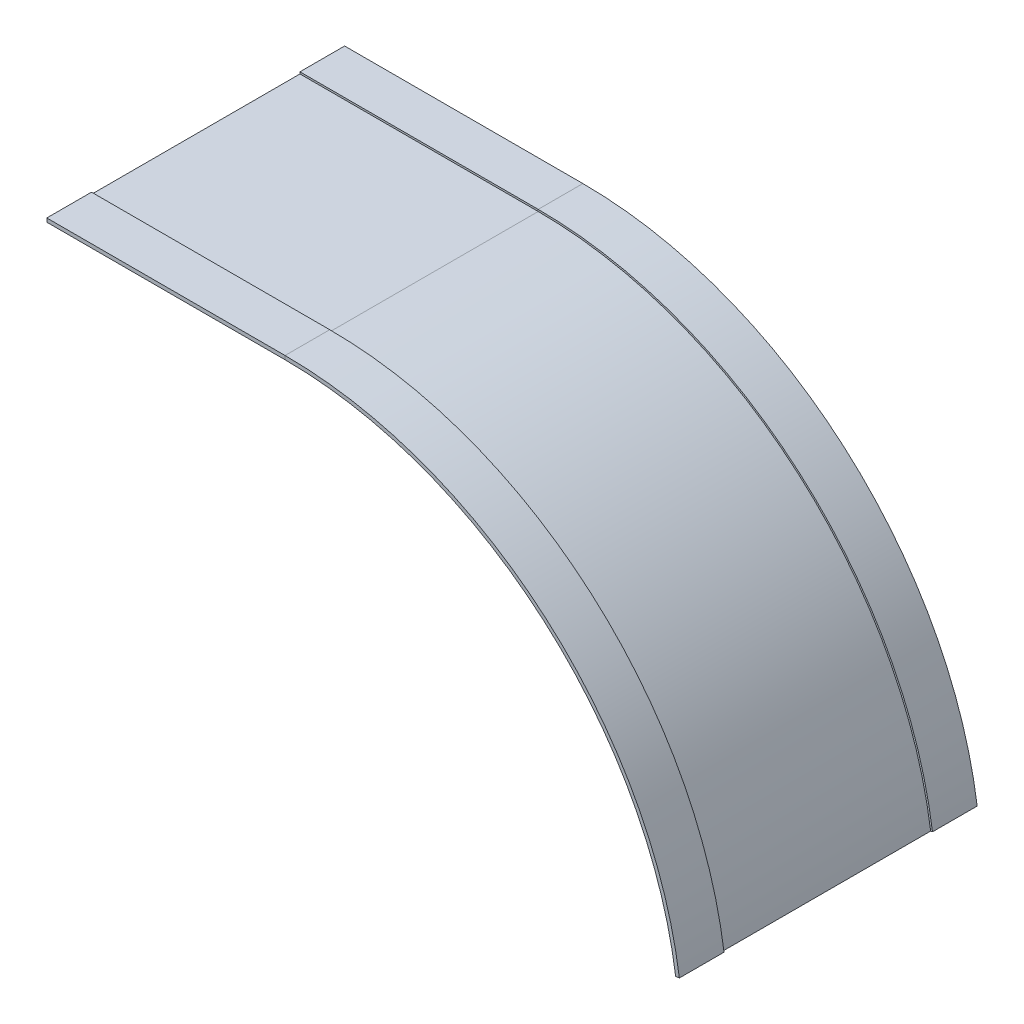
ISO-10303-21;
HEADER;
FILE_DESCRIPTION(('STEP AP214'),'2;1');
FILE_NAME('part.step','',(''),(''),'','','');
FILE_SCHEMA(('AUTOMOTIVE_DESIGN { 1 0 10303 214 1 1 1 1 }'));
ENDSEC;
DATA;
#1=APPLICATION_CONTEXT('core data for automotive mechanical design processes');
#2=APPLICATION_PROTOCOL_DEFINITION('international standard','automotive_design',2000,#1);
#3=PRODUCT_CONTEXT('',#1,'mechanical');
#4=PRODUCT('Part','Part','',(#3));
#5=PRODUCT_RELATED_PRODUCT_CATEGORY('part','',(#4));
#6=PRODUCT_DEFINITION_FORMATION('','',#4);
#7=PRODUCT_DEFINITION_CONTEXT('part definition',#1,'design');
#8=PRODUCT_DEFINITION('design','',#6,#7);
#9=PRODUCT_DEFINITION_SHAPE('','',#8);
#10=(LENGTH_UNIT() NAMED_UNIT(*) SI_UNIT(.MILLI.,.METRE.));
#11=(NAMED_UNIT(*) PLANE_ANGLE_UNIT() SI_UNIT($,.RADIAN.));
#12=(NAMED_UNIT(*) SI_UNIT($,.STERADIAN.) SOLID_ANGLE_UNIT());
#13=UNCERTAINTY_MEASURE_WITH_UNIT(LENGTH_MEASURE(1.E-05),#10,'distance_accuracy_value','');
#14=(GEOMETRIC_REPRESENTATION_CONTEXT(3) GLOBAL_UNCERTAINTY_ASSIGNED_CONTEXT((#13)) GLOBAL_UNIT_ASSIGNED_CONTEXT((#10,
#11,#12)) REPRESENTATION_CONTEXT('',''));
#15=CARTESIAN_POINT('',(0.,0.,0.));
#16=DIRECTION('',(0.,0.,1.));
#17=DIRECTION('',(1.,0.,0.));
#18=AXIS2_PLACEMENT_3D('',#15,#16,#17);
#19=CARTESIAN_POINT('',(-190.884848484848,0.,0.));
#20=DIRECTION('',(1.,0.,0.));
#21=DIRECTION('',(0.,0.,-1.));
#22=AXIS2_PLACEMENT_3D('',#19,#20,#21);
#23=PLANE('',#22);
#24=DIRECTION('',(0.,-1.,0.));
#25=VECTOR('',#24,1.);
#26=CARTESIAN_POINT('',(-190.884848484848,87.4856818181818,63.5));
#27=LINE('',#26,#25);
#28=CARTESIAN_POINT('',(-190.884848484848,87.4856818181818,63.5));
#29=VERTEX_POINT('',#28);
#30=CARTESIAN_POINT('',(-190.884848484848,85.8981818181818,63.5));
#31=VERTEX_POINT('',#30);
#32=EDGE_CURVE('E165',#29,#31,#27,.T.);
#33=ORIENTED_EDGE('',*,*,#32,.F.);
#34=DIRECTION('',(0.,0.,1.));
#35=VECTOR('',#34,1.);
#36=CARTESIAN_POINT('',(-190.884848484848,87.4856818181818,44.45));
#37=LINE('',#36,#35);
#38=CARTESIAN_POINT('',(-190.884848484848,87.4856818181818,44.45));
#39=VERTEX_POINT('',#38);
#40=EDGE_CURVE('E167',#39,#29,#37,.T.);
#41=ORIENTED_EDGE('',*,*,#40,.F.);
#42=DIRECTION('',(0.,1.,0.));
#43=VECTOR('',#42,1.);
#44=CARTESIAN_POINT('',(-190.884848484848,86.6919318181818,44.45));
#45=LINE('',#44,#43);
#46=CARTESIAN_POINT('',(-190.884848484848,86.6919318181818,44.45));
#47=VERTEX_POINT('',#46);
#48=EDGE_CURVE('E98',#47,#39,#45,.T.);
#49=ORIENTED_EDGE('',*,*,#48,.F.);
#50=DIRECTION('',(0.,0.,1.));
#51=VECTOR('',#50,1.);
#52=CARTESIAN_POINT('',(-190.884848484848,86.6919318181818,-44.45));
#53=LINE('',#52,#51);
#54=CARTESIAN_POINT('',(-190.884848484848,86.6919318181818,-44.45));
#55=VERTEX_POINT('',#54);
#56=EDGE_CURVE('E102',#55,#47,#53,.T.);
#57=ORIENTED_EDGE('',*,*,#56,.F.);
#58=DIRECTION('',(0.,-1.,0.));
#59=VECTOR('',#58,1.);
#60=CARTESIAN_POINT('',(-190.884848484848,87.4856818181818,-44.45));
#61=LINE('',#60,#59);
#62=CARTESIAN_POINT('',(-190.884848484848,87.4856818181818,-44.45));
#63=VERTEX_POINT('',#62);
#64=EDGE_CURVE('E107',#63,#55,#61,.T.);
#65=ORIENTED_EDGE('',*,*,#64,.F.);
#66=DIRECTION('',(0.,0.,1.));
#67=VECTOR('',#66,1.);
#68=CARTESIAN_POINT('',(-190.884848484848,87.4856818181818,-63.5));
#69=LINE('',#68,#67);
#70=CARTESIAN_POINT('',(-190.884848484848,87.4856818181818,-63.5));
#71=VERTEX_POINT('',#70);
#72=EDGE_CURVE('E207',#71,#63,#69,.T.);
#73=ORIENTED_EDGE('',*,*,#72,.F.);
#74=DIRECTION('',(0.,1.,0.));
#75=VECTOR('',#74,1.);
#76=CARTESIAN_POINT('',(-190.884848484848,85.8981818181818,-63.5));
#77=LINE('',#76,#75);
#78=CARTESIAN_POINT('',(-190.884848484848,85.8981818181818,-63.5));
#79=VERTEX_POINT('',#78);
#80=EDGE_CURVE('E158',#79,#71,#77,.T.);
#81=ORIENTED_EDGE('',*,*,#80,.F.);
#82=DIRECTION('',(0.,0.,-1.));
#83=VECTOR('',#82,1.);
#84=CARTESIAN_POINT('',(-190.884848484848,85.8981818181818,63.5));
#85=LINE('',#84,#83);
#86=EDGE_CURVE('E162',#31,#79,#85,.T.);
#87=ORIENTED_EDGE('',*,*,#86,.F.);
#88=EDGE_LOOP('',(#33,#41,#49,#57,#65,#73,#81,#87));
#89=FACE_BOUND('',#88,.T.);
#90=ADVANCED_FACE('F34',(#89),#23,.F.);
#91=CARTESIAN_POINT('',(-7.73699587466362,-70.7197212692968,0.));
#92=DIRECTION('',(0.141509433962264,-0.989936907130793,0.));
#93=DIRECTION('',(0.,0.,-1.));
#94=AXIS2_PLACEMENT_3D('',#91,#92,#93);
#95=PLANE('',#94);
#96=DIRECTION('',(-0.989936907130793,-0.141509433962264,0.));
#97=VECTOR('',#96,1.);
#98=CARTESIAN_POINT('',(78.8683094026559,-58.3396719554032,63.5));
#99=LINE('',#98,#97);
#100=CARTESIAN_POINT('',(78.8683094026559,-58.3396719554032,63.5));
#101=VERTEX_POINT('',#100);
#102=CARTESIAN_POINT('',(77.2967845625857,-58.5643181818183,63.5));
#103=VERTEX_POINT('',#102);
#104=EDGE_CURVE('E190',#101,#103,#99,.T.);
#105=ORIENTED_EDGE('',*,*,#104,.T.);
#106=DIRECTION('',(0.,0.,-1.));
#107=VECTOR('',#106,1.);
#108=CARTESIAN_POINT('',(77.2967845625857,-58.5643181818183,63.5));
#109=LINE('',#108,#107);
#110=CARTESIAN_POINT('',(77.2967845625857,-58.5643181818183,-63.5));
#111=VERTEX_POINT('',#110);
#112=EDGE_CURVE('E126',#103,#111,#109,.T.);
#113=ORIENTED_EDGE('',*,*,#112,.T.);
#114=DIRECTION('',(0.989936907130793,0.141509433962264,0.));
#115=VECTOR('',#114,1.);
#116=CARTESIAN_POINT('',(77.2967845625857,-58.5643181818183,-63.5));
#117=LINE('',#116,#115);
#118=CARTESIAN_POINT('',(78.8683094026559,-58.3396719554032,-63.5));
#119=VERTEX_POINT('',#118);
#120=EDGE_CURVE('E122',#111,#119,#117,.T.);
#121=ORIENTED_EDGE('',*,*,#120,.T.);
#122=DIRECTION('',(0.,0.,1.));
#123=VECTOR('',#122,1.);
#124=CARTESIAN_POINT('',(78.8683094026559,-58.3396719554032,-63.5));
#125=LINE('',#124,#123);
#126=CARTESIAN_POINT('',(78.8683094026559,-58.3396719554032,-44.45));
#127=VERTEX_POINT('',#126);
#128=EDGE_CURVE('E117',#119,#127,#125,.T.);
#129=ORIENTED_EDGE('',*,*,#128,.T.);
#130=DIRECTION('',(-0.989936907130793,-0.141509433962264,0.));
#131=VECTOR('',#130,1.);
#132=CARTESIAN_POINT('',(78.8683094026559,-58.3396719554032,-44.45));
#133=LINE('',#132,#131);
#134=CARTESIAN_POINT('',(78.0825469826208,-58.4519950686107,-44.45));
#135=VERTEX_POINT('',#134);
#136=EDGE_CURVE('E225',#127,#135,#133,.T.);
#137=ORIENTED_EDGE('',*,*,#136,.T.);
#138=DIRECTION('',(0.,0.,1.));
#139=VECTOR('',#138,1.);
#140=CARTESIAN_POINT('',(78.0825469826208,-58.4519950686107,-44.45));
#141=LINE('',#140,#139);
#142=CARTESIAN_POINT('',(78.0825469826208,-58.4519950686107,44.45));
#143=VERTEX_POINT('',#142);
#144=EDGE_CURVE('E53',#135,#143,#141,.T.);
#145=ORIENTED_EDGE('',*,*,#144,.T.);
#146=DIRECTION('',(0.989936907130793,0.141509433962264,0.));
#147=VECTOR('',#146,1.);
#148=CARTESIAN_POINT('',(78.0825469826208,-58.4519950686107,44.45));
#149=LINE('',#148,#147);
#150=CARTESIAN_POINT('',(78.8683094026559,-58.3396719554032,44.45));
#151=VERTEX_POINT('',#150);
#152=EDGE_CURVE('E47',#143,#151,#149,.T.);
#153=ORIENTED_EDGE('',*,*,#152,.T.);
#154=DIRECTION('',(0.,0.,1.));
#155=VECTOR('',#154,1.);
#156=CARTESIAN_POINT('',(78.8683094026559,-58.3396719554032,44.45));
#157=LINE('',#156,#155);
#158=EDGE_CURVE('E11',#151,#101,#157,.T.);
#159=ORIENTED_EDGE('',*,*,#158,.T.);
#160=EDGE_LOOP('',(#105,#113,#121,#129,#137,#145,#153,#159));
#161=FACE_BOUND('',#160,.T.);
#162=ADVANCED_FACE('F276',(#161),#95,.T.);
#163=CARTESIAN_POINT('',(-190.884848484848,87.4856818181818,63.5));
#164=DIRECTION('',(0.,0.,1.));
#165=DIRECTION('',(1.,0.,0.));
#166=AXIS2_PLACEMENT_3D('',#163,#164,#165);
#167=PLANE('',#166);
#168=DIRECTION('',(1.,0.,0.));
#169=VECTOR('',#168,1.);
#170=CARTESIAN_POINT('',(-190.884848484848,85.8981818181818,63.5));
#171=LINE('',#170,#169);
#172=CARTESIAN_POINT('',(-89.2848484848484,85.8981818181818,63.5));
#173=VERTEX_POINT('',#172);
#174=EDGE_CURVE('E186',#31,#173,#171,.T.);
#175=ORIENTED_EDGE('',*,*,#174,.T.);
#176=DIRECTION('',(0.,-1.,0.));
#177=VECTOR('',#176,1.);
#178=CARTESIAN_POINT('',(-89.2848484848484,87.4856818181818,63.5));
#179=LINE('',#178,#177);
#180=CARTESIAN_POINT('',(-89.2848484848484,87.4856818181818,63.5));
#181=VERTEX_POINT('',#180);
#182=EDGE_CURVE('E184',#181,#173,#179,.T.);
#183=ORIENTED_EDGE('',*,*,#182,.F.);
#184=DIRECTION('',(1.,0.,0.));
#185=VECTOR('',#184,1.);
#186=CARTESIAN_POINT('',(-190.884848484848,87.4856818181818,63.5));
#187=LINE('',#186,#185);
#188=EDGE_CURVE('E177',#29,#181,#187,.T.);
#189=ORIENTED_EDGE('',*,*,#188,.F.);
#190=ORIENTED_EDGE('',*,*,#32,.T.);
#191=EDGE_LOOP('',(#175,#183,#189,#190));
#192=FACE_BOUND('',#191,.T.);
#193=ADVANCED_FACE('F182',(#192),#167,.T.);
#194=CARTESIAN_POINT('',(-190.884848484848,85.8981818181818,63.5));
#195=DIRECTION('',(0.,-1.,0.));
#196=DIRECTION('',(0.,0.,-1.));
#197=AXIS2_PLACEMENT_3D('',#194,#195,#196);
#198=PLANE('',#197);
#199=DIRECTION('',(1.,0.,0.));
#200=VECTOR('',#199,1.);
#201=CARTESIAN_POINT('',(-190.884848484848,85.8981818181818,-63.5));
#202=LINE('',#201,#200);
#203=CARTESIAN_POINT('',(-89.2848484848484,85.8981818181818,-63.5));
#204=VERTEX_POINT('',#203);
#205=EDGE_CURVE('E200',#79,#204,#202,.T.);
#206=ORIENTED_EDGE('',*,*,#205,.T.);
#207=DIRECTION('',(0.,0.,-1.));
#208=VECTOR('',#207,1.);
#209=CARTESIAN_POINT('',(-89.2848484848484,85.8981818181818,63.5));
#210=LINE('',#209,#208);
#211=EDGE_CURVE('E198',#173,#204,#210,.T.);
#212=ORIENTED_EDGE('',*,*,#211,.F.);
#213=ORIENTED_EDGE('',*,*,#174,.F.);
#214=ORIENTED_EDGE('',*,*,#86,.T.);
#215=EDGE_LOOP('',(#206,#212,#213,#214));
#216=FACE_BOUND('',#215,.T.);
#217=ADVANCED_FACE('F272',(#216),#198,.T.);
#218=CARTESIAN_POINT('',(-190.884848484848,85.8981818181818,-63.5));
#219=DIRECTION('',(0.,0.,-1.));
#220=DIRECTION('',(-1.,0.,0.));
#221=AXIS2_PLACEMENT_3D('',#218,#219,#220);
#222=PLANE('',#221);
#223=DIRECTION('',(1.,0.,0.));
#224=VECTOR('',#223,1.);
#225=CARTESIAN_POINT('',(-190.884848484848,87.4856818181818,-63.5));
#226=LINE('',#225,#224);
#227=CARTESIAN_POINT('',(-89.2848484848484,87.4856818181818,-63.5));
#228=VERTEX_POINT('',#227);
#229=EDGE_CURVE('E209',#71,#228,#226,.T.);
#230=ORIENTED_EDGE('',*,*,#229,.T.);
#231=DIRECTION('',(0.,1.,0.));
#232=VECTOR('',#231,1.);
#233=CARTESIAN_POINT('',(-89.2848484848484,85.8981818181818,-63.5));
#234=LINE('',#233,#232);
#235=EDGE_CURVE('E203',#204,#228,#234,.T.);
#236=ORIENTED_EDGE('',*,*,#235,.F.);
#237=ORIENTED_EDGE('',*,*,#205,.F.);
#238=ORIENTED_EDGE('',*,*,#80,.T.);
#239=EDGE_LOOP('',(#230,#236,#237,#238));
#240=FACE_BOUND('',#239,.T.);
#241=ADVANCED_FACE('F267',(#240),#222,.T.);
#242=CARTESIAN_POINT('',(-190.884848484848,87.4856818181818,-63.5));
#243=DIRECTION('',(0.,1.,0.));
#244=DIRECTION('',(0.,0.,1.));
#245=AXIS2_PLACEMENT_3D('',#242,#243,#244);
#246=PLANE('',#245);
#247=DIRECTION('',(1.,0.,0.));
#248=VECTOR('',#247,1.);
#249=CARTESIAN_POINT('',(-190.884848484848,87.4856818181818,-44.45));
#250=LINE('',#249,#248);
#251=CARTESIAN_POINT('',(-89.2848484848484,87.4856818181818,-44.45));
#252=VERTEX_POINT('',#251);
#253=EDGE_CURVE('E217',#63,#252,#250,.T.);
#254=ORIENTED_EDGE('',*,*,#253,.T.);
#255=DIRECTION('',(0.,0.,1.));
#256=VECTOR('',#255,1.);
#257=CARTESIAN_POINT('',(-89.2848484848484,87.4856818181818,-63.5));
#258=LINE('',#257,#256);
#259=EDGE_CURVE('E212',#228,#252,#258,.T.);
#260=ORIENTED_EDGE('',*,*,#259,.F.);
#261=ORIENTED_EDGE('',*,*,#229,.F.);
#262=ORIENTED_EDGE('',*,*,#72,.T.);
#263=EDGE_LOOP('',(#254,#260,#261,#262));
#264=FACE_BOUND('',#263,.T.);
#265=ADVANCED_FACE('F265',(#264),#246,.T.);
#266=CARTESIAN_POINT('',(-190.884848484848,87.4856818181818,-44.45));
#267=DIRECTION('',(0.,0.,1.));
#268=DIRECTION('',(1.,0.,0.));
#269=AXIS2_PLACEMENT_3D('',#266,#267,#268);
#270=PLANE('',#269);
#271=DIRECTION('',(1.,0.,0.));
#272=VECTOR('',#271,1.);
#273=CARTESIAN_POINT('',(-190.884848484848,86.6919318181818,-44.45));
#274=LINE('',#273,#272);
#275=CARTESIAN_POINT('',(-89.2848484848484,86.6919318181818,-44.45));
#276=VERTEX_POINT('',#275);
#277=EDGE_CURVE('E229',#55,#276,#274,.T.);
#278=ORIENTED_EDGE('',*,*,#277,.T.);
#279=DIRECTION('',(0.,-1.,0.));
#280=VECTOR('',#279,1.);
#281=CARTESIAN_POINT('',(-89.2848484848484,87.4856818181818,-44.45));
#282=LINE('',#281,#280);
#283=EDGE_CURVE('E220',#252,#276,#282,.T.);
#284=ORIENTED_EDGE('',*,*,#283,.F.);
#285=ORIENTED_EDGE('',*,*,#253,.F.);
#286=ORIENTED_EDGE('',*,*,#64,.T.);
#287=EDGE_LOOP('',(#278,#284,#285,#286));
#288=FACE_BOUND('',#287,.T.);
#289=ADVANCED_FACE('F258',(#288),#270,.T.);
#290=CARTESIAN_POINT('',(-190.884848484848,86.6919318181818,-44.45));
#291=DIRECTION('',(0.,1.,0.));
#292=DIRECTION('',(0.,0.,1.));
#293=AXIS2_PLACEMENT_3D('',#290,#291,#292);
#294=PLANE('',#293);
#295=DIRECTION('',(1.,0.,0.));
#296=VECTOR('',#295,1.);
#297=CARTESIAN_POINT('',(-190.884848484848,86.6919318181818,44.45));
#298=LINE('',#297,#296);
#299=CARTESIAN_POINT('',(-89.2848484848484,86.6919318181818,44.45));
#300=VERTEX_POINT('',#299);
#301=EDGE_CURVE('E237',#47,#300,#298,.T.);
#302=ORIENTED_EDGE('',*,*,#301,.T.);
#303=DIRECTION('',(0.,0.,1.));
#304=VECTOR('',#303,1.);
#305=CARTESIAN_POINT('',(-89.2848484848484,86.6919318181818,-44.45));
#306=LINE('',#305,#304);
#307=EDGE_CURVE('E232',#276,#300,#306,.T.);
#308=ORIENTED_EDGE('',*,*,#307,.F.);
#309=ORIENTED_EDGE('',*,*,#277,.F.);
#310=ORIENTED_EDGE('',*,*,#56,.T.);
#311=EDGE_LOOP('',(#302,#308,#309,#310));
#312=FACE_BOUND('',#311,.T.);
#313=ADVANCED_FACE('F255',(#312),#294,.T.);
#314=CARTESIAN_POINT('',(-190.884848484848,86.6919318181818,44.45));
#315=DIRECTION('',(0.,0.,-1.));
#316=DIRECTION('',(-1.,0.,0.));
#317=AXIS2_PLACEMENT_3D('',#314,#315,#316);
#318=PLANE('',#317);
#319=DIRECTION('',(1.,0.,0.));
#320=VECTOR('',#319,1.);
#321=CARTESIAN_POINT('',(-190.884848484848,87.4856818181818,44.45));
#322=LINE('',#321,#320);
#323=CARTESIAN_POINT('',(-89.2848484848484,87.4856818181818,44.45));
#324=VERTEX_POINT('',#323);
#325=EDGE_CURVE('E179',#39,#324,#322,.T.);
#326=ORIENTED_EDGE('',*,*,#325,.T.);
#327=DIRECTION('',(0.,1.,0.));
#328=VECTOR('',#327,1.);
#329=CARTESIAN_POINT('',(-89.2848484848484,86.6919318181818,44.45));
#330=LINE('',#329,#328);
#331=EDGE_CURVE('E240',#300,#324,#330,.T.);
#332=ORIENTED_EDGE('',*,*,#331,.F.);
#333=ORIENTED_EDGE('',*,*,#301,.F.);
#334=ORIENTED_EDGE('',*,*,#48,.T.);
#335=EDGE_LOOP('',(#326,#332,#333,#334));
#336=FACE_BOUND('',#335,.T.);
#337=ADVANCED_FACE('F249',(#336),#318,.T.);
#338=CARTESIAN_POINT('',(-190.884848484848,87.4856818181818,44.45));
#339=DIRECTION('',(0.,1.,0.));
#340=DIRECTION('',(0.,0.,1.));
#341=AXIS2_PLACEMENT_3D('',#338,#339,#340);
#342=PLANE('',#341);
#343=DIRECTION('',(0.,0.,1.));
#344=VECTOR('',#343,1.);
#345=CARTESIAN_POINT('',(-89.2848484848484,87.4856818181818,44.45));
#346=LINE('',#345,#344);
#347=EDGE_CURVE('E196',#324,#181,#346,.T.);
#348=ORIENTED_EDGE('',*,*,#347,.F.);
#349=ORIENTED_EDGE('',*,*,#325,.F.);
#350=ORIENTED_EDGE('',*,*,#40,.T.);
#351=ORIENTED_EDGE('',*,*,#188,.T.);
#352=EDGE_LOOP('',(#348,#349,#350,#351));
#353=FACE_BOUND('',#352,.T.);
#354=ADVANCED_FACE('F176',(#353),#342,.T.);
#355=CARTESIAN_POINT('',(-89.2848484848484,87.4856818181818,63.5));
#356=DIRECTION('',(0.,0.,1.));
#357=DIRECTION('',(1.,0.,0.));
#358=AXIS2_PLACEMENT_3D('',#355,#356,#357);
#359=PLANE('',#358);
#360=CARTESIAN_POINT('',(-89.2848484848484,-82.3768181818183,63.5));
#361=DIRECTION('',(0.,0.,-1.));
#362=DIRECTION('',(0.,1.,0.));
#363=AXIS2_PLACEMENT_3D('',#360,#361,#362);
#364=CIRCLE('',#363,168.275);
#365=EDGE_CURVE('E149',#173,#103,#364,.T.);
#366=ORIENTED_EDGE('',*,*,#365,.T.);
#367=ORIENTED_EDGE('',*,*,#104,.F.);
#368=CARTESIAN_POINT('',(-89.2848484848484,-82.3768181818183,63.5));
#369=DIRECTION('',(0.,0.,-1.));
#370=DIRECTION('',(0.,1.,0.));
#371=AXIS2_PLACEMENT_3D('',#368,#369,#370);
#372=CIRCLE('',#371,169.8625);
#373=EDGE_CURVE('E192',#181,#101,#372,.T.);
#374=ORIENTED_EDGE('',*,*,#373,.F.);
#375=ORIENTED_EDGE('',*,*,#182,.T.);
#376=EDGE_LOOP('',(#366,#367,#374,#375));
#377=FACE_BOUND('',#376,.T.);
#378=ADVANCED_FACE('F274',(#377),#359,.T.);
#379=CARTESIAN_POINT('',(-89.2848484848484,-82.3768181818183,0.));
#380=DIRECTION('',(0.,0.,-1.));
#381=DIRECTION('',(-1.,0.,0.));
#382=AXIS2_PLACEMENT_3D('',#379,#380,#381);
#383=CYLINDRICAL_SURFACE('',#382,168.275);
#384=CARTESIAN_POINT('',(-89.2848484848484,-82.3768181818183,-63.5));
#385=DIRECTION('',(0.,0.,-1.));
#386=DIRECTION('',(0.,1.,0.));
#387=AXIS2_PLACEMENT_3D('',#384,#385,#386);
#388=CIRCLE('',#387,168.275);
#389=EDGE_CURVE('E142',#204,#111,#388,.T.);
#390=ORIENTED_EDGE('',*,*,#389,.T.);
#391=ORIENTED_EDGE('',*,*,#112,.F.);
#392=ORIENTED_EDGE('',*,*,#365,.F.);
#393=ORIENTED_EDGE('',*,*,#211,.T.);
#394=EDGE_LOOP('',(#390,#391,#392,#393));
#395=FACE_BOUND('',#394,.T.);
#396=ADVANCED_FACE('F270',(#395),#383,.F.);
#397=CARTESIAN_POINT('',(-89.2848484848484,85.8981818181818,-63.5));
#398=DIRECTION('',(0.,0.,-1.));
#399=DIRECTION('',(-1.,0.,0.));
#400=AXIS2_PLACEMENT_3D('',#397,#398,#399);
#401=PLANE('',#400);
#402=CARTESIAN_POINT('',(-89.2848484848484,-82.3768181818183,-63.5));
#403=DIRECTION('',(0.,0.,-1.));
#404=DIRECTION('',(0.,1.,0.));
#405=AXIS2_PLACEMENT_3D('',#402,#403,#404);
#406=CIRCLE('',#405,169.8625);
#407=EDGE_CURVE('E135',#228,#119,#406,.T.);
#408=ORIENTED_EDGE('',*,*,#407,.T.);
#409=ORIENTED_EDGE('',*,*,#120,.F.);
#410=ORIENTED_EDGE('',*,*,#389,.F.);
#411=ORIENTED_EDGE('',*,*,#235,.T.);
#412=EDGE_LOOP('',(#408,#409,#410,#411));
#413=FACE_BOUND('',#412,.T.);
#414=ADVANCED_FACE('F269',(#413),#401,.T.);
#415=CARTESIAN_POINT('',(-89.2848484848484,-82.3768181818183,0.));
#416=DIRECTION('',(0.,0.,-1.));
#417=DIRECTION('',(-1.,0.,0.));
#418=AXIS2_PLACEMENT_3D('',#415,#416,#417);
#419=CYLINDRICAL_SURFACE('',#418,169.8625);
#420=CARTESIAN_POINT('',(-89.2848484848484,-82.3768181818183,-44.45));
#421=DIRECTION('',(0.,0.,-1.));
#422=DIRECTION('',(0.,1.,0.));
#423=AXIS2_PLACEMENT_3D('',#420,#421,#422);
#424=CIRCLE('',#423,169.8625);
#425=EDGE_CURVE('E222',#252,#127,#424,.T.);
#426=ORIENTED_EDGE('',*,*,#425,.T.);
#427=ORIENTED_EDGE('',*,*,#128,.F.);
#428=ORIENTED_EDGE('',*,*,#407,.F.);
#429=ORIENTED_EDGE('',*,*,#259,.T.);
#430=EDGE_LOOP('',(#426,#427,#428,#429));
#431=FACE_BOUND('',#430,.T.);
#432=ADVANCED_FACE('F262',(#431),#419,.T.);
#433=CARTESIAN_POINT('',(-89.2848484848484,87.4856818181818,-44.45));
#434=DIRECTION('',(0.,0.,1.));
#435=DIRECTION('',(1.,0.,0.));
#436=AXIS2_PLACEMENT_3D('',#433,#434,#435);
#437=PLANE('',#436);
#438=CARTESIAN_POINT('',(-89.2848484848484,-82.3768181818183,-44.45));
#439=DIRECTION('',(0.,0.,-1.));
#440=DIRECTION('',(0.,1.,0.));
#441=AXIS2_PLACEMENT_3D('',#438,#439,#440);
#442=CIRCLE('',#441,169.06875);
#443=EDGE_CURVE('E86',#276,#135,#442,.T.);
#444=ORIENTED_EDGE('',*,*,#443,.T.);
#445=ORIENTED_EDGE('',*,*,#136,.F.);
#446=ORIENTED_EDGE('',*,*,#425,.F.);
#447=ORIENTED_EDGE('',*,*,#283,.T.);
#448=EDGE_LOOP('',(#444,#445,#446,#447));
#449=FACE_BOUND('',#448,.T.);
#450=ADVANCED_FACE('F261',(#449),#437,.T.);
#451=CARTESIAN_POINT('',(-89.2848484848484,-82.3768181818183,0.));
#452=DIRECTION('',(0.,0.,-1.));
#453=DIRECTION('',(-1.,0.,0.));
#454=AXIS2_PLACEMENT_3D('',#451,#452,#453);
#455=CYLINDRICAL_SURFACE('',#454,169.06875);
#456=CARTESIAN_POINT('',(-89.2848484848484,-82.3768181818183,44.45));
#457=DIRECTION('',(0.,0.,-1.));
#458=DIRECTION('',(0.,1.,0.));
#459=AXIS2_PLACEMENT_3D('',#456,#457,#458);
#460=CIRCLE('',#459,169.06875);
#461=EDGE_CURVE('E78',#300,#143,#460,.T.);
#462=ORIENTED_EDGE('',*,*,#461,.T.);
#463=ORIENTED_EDGE('',*,*,#144,.F.);
#464=ORIENTED_EDGE('',*,*,#443,.F.);
#465=ORIENTED_EDGE('',*,*,#307,.T.);
#466=EDGE_LOOP('',(#462,#463,#464,#465));
#467=FACE_BOUND('',#466,.T.);
#468=ADVANCED_FACE('F252',(#467),#455,.T.);
#469=CARTESIAN_POINT('',(-89.2848484848484,86.6919318181818,44.45));
#470=DIRECTION('',(0.,0.,-1.));
#471=DIRECTION('',(-1.,0.,0.));
#472=AXIS2_PLACEMENT_3D('',#469,#470,#471);
#473=PLANE('',#472);
#474=CARTESIAN_POINT('',(-89.2848484848484,-82.3768181818183,44.45));
#475=DIRECTION('',(0.,0.,-1.));
#476=DIRECTION('',(0.,1.,0.));
#477=AXIS2_PLACEMENT_3D('',#474,#475,#476);
#478=CIRCLE('',#477,169.8625);
#479=EDGE_CURVE('E41',#324,#151,#478,.T.);
#480=ORIENTED_EDGE('',*,*,#479,.T.);
#481=ORIENTED_EDGE('',*,*,#152,.F.);
#482=ORIENTED_EDGE('',*,*,#461,.F.);
#483=ORIENTED_EDGE('',*,*,#331,.T.);
#484=EDGE_LOOP('',(#480,#481,#482,#483));
#485=FACE_BOUND('',#484,.T.);
#486=ADVANCED_FACE('F251',(#485),#473,.T.);
#487=CARTESIAN_POINT('',(-89.2848484848484,-82.3768181818183,0.));
#488=DIRECTION('',(0.,0.,-1.));
#489=DIRECTION('',(-1.,0.,0.));
#490=AXIS2_PLACEMENT_3D('',#487,#488,#489);
#491=CYLINDRICAL_SURFACE('',#490,169.8625);
#492=ORIENTED_EDGE('',*,*,#158,.F.);
#493=ORIENTED_EDGE('',*,*,#479,.F.);
#494=ORIENTED_EDGE('',*,*,#347,.T.);
#495=ORIENTED_EDGE('',*,*,#373,.T.);
#496=EDGE_LOOP('',(#492,#493,#494,#495));
#497=FACE_BOUND('',#496,.T.);
#498=ADVANCED_FACE('F247',(#497),#491,.T.);
#499=CLOSED_SHELL('',(#90,#162,#193,#217,#241,#265,#289,#313,#337,#354,#378,#396,#414,#432,#450,
#468,#486,#498));
#500=MANIFOLD_SOLID_BREP('B2',#499);
#501=ADVANCED_BREP_SHAPE_REPRESENTATION('',(#18,#500),#14);
#502=SHAPE_DEFINITION_REPRESENTATION(#9,#501);
ENDSEC;
END-ISO-10303-21;
